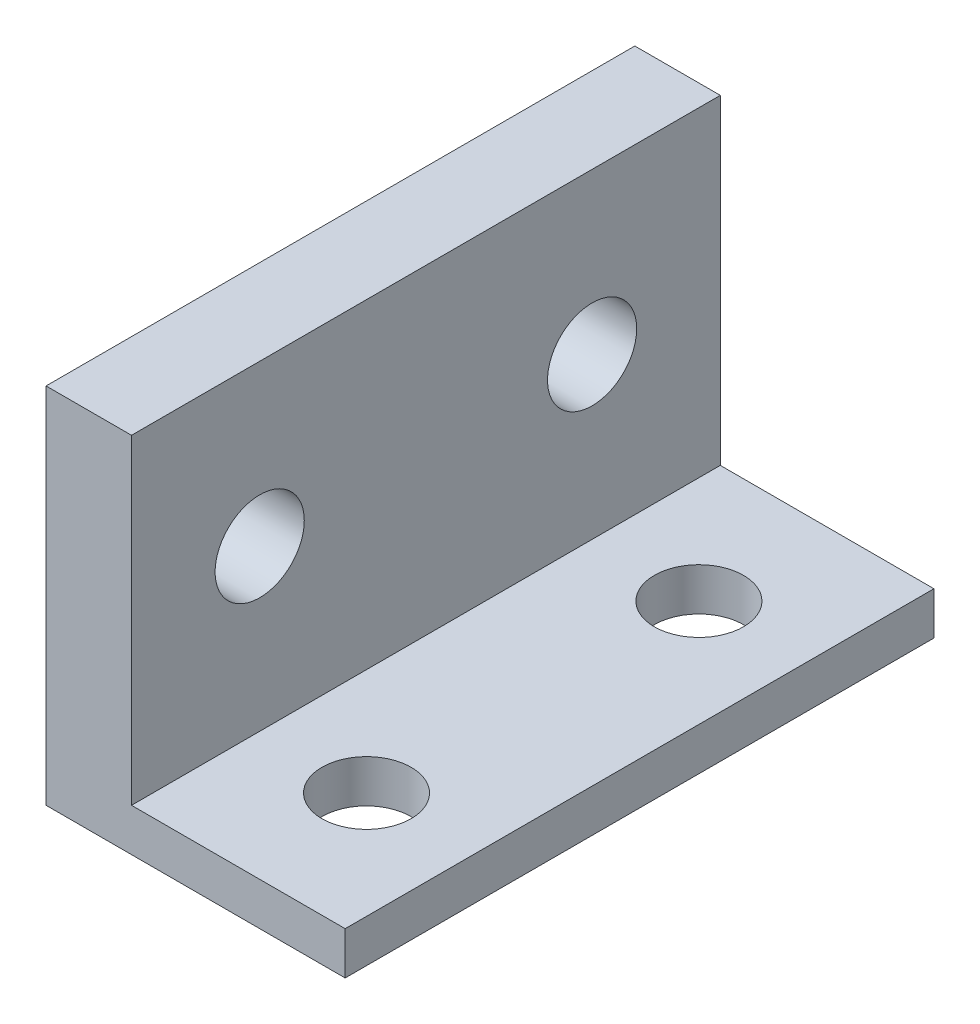
ISO-10303-21;
HEADER;
FILE_DESCRIPTION(('STEP AP214'),'2;1');
FILE_NAME('part.step','',(''),(''),'','','');
FILE_SCHEMA(('AUTOMOTIVE_DESIGN { 1 0 10303 214 1 1 1 1 }'));
ENDSEC;
DATA;
#1=APPLICATION_CONTEXT('core data for automotive mechanical design processes');
#2=APPLICATION_PROTOCOL_DEFINITION('international standard','automotive_design',2000,#1);
#3=PRODUCT_CONTEXT('',#1,'mechanical');
#4=PRODUCT('Part','Part','',(#3));
#5=PRODUCT_RELATED_PRODUCT_CATEGORY('part','',(#4));
#6=PRODUCT_DEFINITION_FORMATION('','',#4);
#7=PRODUCT_DEFINITION_CONTEXT('part definition',#1,'design');
#8=PRODUCT_DEFINITION('design','',#6,#7);
#9=PRODUCT_DEFINITION_SHAPE('','',#8);
#10=(LENGTH_UNIT() NAMED_UNIT(*) SI_UNIT(.MILLI.,.METRE.));
#11=(NAMED_UNIT(*) PLANE_ANGLE_UNIT() SI_UNIT($,.RADIAN.));
#12=(NAMED_UNIT(*) SI_UNIT($,.STERADIAN.) SOLID_ANGLE_UNIT());
#13=UNCERTAINTY_MEASURE_WITH_UNIT(LENGTH_MEASURE(1.E-05),#10,'distance_accuracy_value','');
#14=(GEOMETRIC_REPRESENTATION_CONTEXT(3) GLOBAL_UNCERTAINTY_ASSIGNED_CONTEXT((#13)) GLOBAL_UNIT_ASSIGNED_CONTEXT((#10,
#11,#12)) REPRESENTATION_CONTEXT('',''));
#15=CARTESIAN_POINT('',(0.,0.,0.));
#16=DIRECTION('',(0.,0.,1.));
#17=DIRECTION('',(1.,0.,0.));
#18=AXIS2_PLACEMENT_3D('',#15,#16,#17);
#19=CARTESIAN_POINT('',(0.,0.,35.));
#20=DIRECTION('',(0.,0.,1.));
#21=DIRECTION('',(1.,0.,0.));
#22=AXIS2_PLACEMENT_3D('',#19,#20,#21);
#23=PLANE('',#22);
#24=DIRECTION('',(1.,0.,0.));
#25=VECTOR('',#24,1.);
#26=CARTESIAN_POINT('',(0.,21.59,35.));
#27=LINE('',#26,#25);
#28=CARTESIAN_POINT('',(0.,21.59,35.));
#29=VERTEX_POINT('',#28);
#30=CARTESIAN_POINT('',(5.08,21.59,35.));
#31=VERTEX_POINT('',#30);
#32=EDGE_CURVE('E95',#29,#31,#27,.T.);
#33=ORIENTED_EDGE('',*,*,#32,.F.);
#34=DIRECTION('',(0.,1.,0.));
#35=VECTOR('',#34,1.);
#36=CARTESIAN_POINT('',(0.,2.54,35.));
#37=LINE('',#36,#35);
#38=CARTESIAN_POINT('',(0.,0.,35.));
#39=VERTEX_POINT('',#38);
#40=EDGE_CURVE('E140',#39,#29,#37,.T.);
#41=ORIENTED_EDGE('',*,*,#40,.F.);
#42=DIRECTION('',(1.,0.,0.));
#43=VECTOR('',#42,1.);
#44=CARTESIAN_POINT('',(0.,0.,35.));
#45=LINE('',#44,#43);
#46=CARTESIAN_POINT('',(17.78,0.,35.));
#47=VERTEX_POINT('',#46);
#48=EDGE_CURVE('E99',#39,#47,#45,.T.);
#49=ORIENTED_EDGE('',*,*,#48,.T.);
#50=DIRECTION('',(0.,1.,0.));
#51=VECTOR('',#50,1.);
#52=CARTESIAN_POINT('',(17.78,0.,35.));
#53=LINE('',#52,#51);
#54=CARTESIAN_POINT('',(17.78,2.54,35.));
#55=VERTEX_POINT('',#54);
#56=EDGE_CURVE('E109',#47,#55,#53,.T.);
#57=ORIENTED_EDGE('',*,*,#56,.T.);
#58=DIRECTION('',(1.,0.,0.));
#59=VECTOR('',#58,1.);
#60=CARTESIAN_POINT('',(0.,2.54,35.));
#61=LINE('',#60,#59);
#62=CARTESIAN_POINT('',(5.08,2.54,35.));
#63=VERTEX_POINT('',#62);
#64=EDGE_CURVE('E107',#63,#55,#61,.T.);
#65=ORIENTED_EDGE('',*,*,#64,.F.);
#66=DIRECTION('',(0.,1.,0.));
#67=VECTOR('',#66,1.);
#68=CARTESIAN_POINT('',(5.08,2.54,35.));
#69=LINE('',#68,#67);
#70=EDGE_CURVE('E137',#63,#31,#69,.T.);
#71=ORIENTED_EDGE('',*,*,#70,.T.);
#72=EDGE_LOOP('',(#33,#41,#49,#57,#65,#71));
#73=FACE_BOUND('',#72,.T.);
#74=ADVANCED_FACE('F33',(#73),#23,.T.);
#75=CARTESIAN_POINT('',(0.,21.59,35.));
#76=DIRECTION('',(0.,1.,0.));
#77=DIRECTION('',(0.,0.,1.));
#78=AXIS2_PLACEMENT_3D('',#75,#76,#77);
#79=PLANE('',#78);
#80=DIRECTION('',(1.,0.,0.));
#81=VECTOR('',#80,1.);
#82=CARTESIAN_POINT('',(0.,21.59,0.));
#83=LINE('',#82,#81);
#84=CARTESIAN_POINT('',(0.,21.59,0.));
#85=VERTEX_POINT('',#84);
#86=CARTESIAN_POINT('',(5.08,21.59,0.));
#87=VERTEX_POINT('',#86);
#88=EDGE_CURVE('E100',#85,#87,#83,.T.);
#89=ORIENTED_EDGE('',*,*,#88,.F.);
#90=DIRECTION('',(0.,0.,-1.));
#91=VECTOR('',#90,1.);
#92=CARTESIAN_POINT('',(0.,21.59,35.));
#93=LINE('',#92,#91);
#94=EDGE_CURVE('E11',#29,#85,#93,.T.);
#95=ORIENTED_EDGE('',*,*,#94,.F.);
#96=ORIENTED_EDGE('',*,*,#32,.T.);
#97=DIRECTION('',(0.,0.,-1.));
#98=VECTOR('',#97,1.);
#99=CARTESIAN_POINT('',(5.08,21.59,35.));
#100=LINE('',#99,#98);
#101=EDGE_CURVE('E142',#31,#87,#100,.T.);
#102=ORIENTED_EDGE('',*,*,#101,.T.);
#103=EDGE_LOOP('',(#89,#95,#96,#102));
#104=FACE_BOUND('',#103,.T.);
#105=ADVANCED_FACE('F148',(#104),#79,.T.);
#106=CARTESIAN_POINT('',(0.,0.,0.));
#107=DIRECTION('',(0.,0.,1.));
#108=DIRECTION('',(1.,0.,0.));
#109=AXIS2_PLACEMENT_3D('',#106,#107,#108);
#110=PLANE('',#109);
#111=ORIENTED_EDGE('',*,*,#88,.T.);
#112=DIRECTION('',(0.,1.,0.));
#113=VECTOR('',#112,1.);
#114=CARTESIAN_POINT('',(5.08,2.54,0.));
#115=LINE('',#114,#113);
#116=CARTESIAN_POINT('',(5.08,2.54,0.));
#117=VERTEX_POINT('',#116);
#118=EDGE_CURVE('E96',#117,#87,#115,.T.);
#119=ORIENTED_EDGE('',*,*,#118,.F.);
#120=DIRECTION('',(1.,0.,0.));
#121=VECTOR('',#120,1.);
#122=CARTESIAN_POINT('',(0.,2.54,0.));
#123=LINE('',#122,#121);
#124=CARTESIAN_POINT('',(17.78,2.54,0.));
#125=VERTEX_POINT('',#124);
#126=EDGE_CURVE('E111',#117,#125,#123,.T.);
#127=ORIENTED_EDGE('',*,*,#126,.T.);
#128=DIRECTION('',(0.,1.,0.));
#129=VECTOR('',#128,1.);
#130=CARTESIAN_POINT('',(17.78,0.,0.));
#131=LINE('',#130,#129);
#132=CARTESIAN_POINT('',(17.78,0.,0.));
#133=VERTEX_POINT('',#132);
#134=EDGE_CURVE('E106',#133,#125,#131,.T.);
#135=ORIENTED_EDGE('',*,*,#134,.F.);
#136=DIRECTION('',(1.,0.,0.));
#137=VECTOR('',#136,1.);
#138=CARTESIAN_POINT('',(0.,0.,0.));
#139=LINE('',#138,#137);
#140=CARTESIAN_POINT('',(0.,0.,0.));
#141=VERTEX_POINT('',#140);
#142=EDGE_CURVE('E82',#141,#133,#139,.T.);
#143=ORIENTED_EDGE('',*,*,#142,.F.);
#144=DIRECTION('',(0.,1.,0.));
#145=VECTOR('',#144,1.);
#146=CARTESIAN_POINT('',(0.,2.54,0.));
#147=LINE('',#146,#145);
#148=EDGE_CURVE('E88',#141,#85,#147,.T.);
#149=ORIENTED_EDGE('',*,*,#148,.T.);
#150=EDGE_LOOP('',(#111,#119,#127,#135,#143,#149));
#151=FACE_BOUND('',#150,.T.);
#152=ADVANCED_FACE('F104',(#151),#110,.F.);
#153=CARTESIAN_POINT('',(5.08,2.54,35.));
#154=DIRECTION('',(-1.,0.,0.));
#155=DIRECTION('',(0.,0.,1.));
#156=AXIS2_PLACEMENT_3D('',#153,#154,#155);
#157=PLANE('',#156);
#158=CARTESIAN_POINT('',(5.08,12.065,27.38));
#159=DIRECTION('',(1.,0.,0.));
#160=DIRECTION('',(0.,0.,-1.));
#161=AXIS2_PLACEMENT_3D('',#158,#159,#160);
#162=CIRCLE('',#161,2.65);
#163=CARTESIAN_POINT('',(5.08,12.065,24.73));
#164=VERTEX_POINT('',#163);
#165=EDGE_CURVE('E189',#164,#164,#162,.T.);
#166=ORIENTED_EDGE('',*,*,#165,.F.);
#167=EDGE_LOOP('',(#166));
#168=FACE_BOUND('',#167,.T.);
#169=CARTESIAN_POINT('',(5.08,12.065,7.62));
#170=DIRECTION('',(1.,0.,0.));
#171=DIRECTION('',(0.,0.,-1.));
#172=AXIS2_PLACEMENT_3D('',#169,#170,#171);
#173=CIRCLE('',#172,2.65);
#174=CARTESIAN_POINT('',(5.08,12.065,4.97));
#175=VERTEX_POINT('',#174);
#176=EDGE_CURVE('E127',#175,#175,#173,.T.);
#177=ORIENTED_EDGE('',*,*,#176,.F.);
#178=EDGE_LOOP('',(#177));
#179=FACE_BOUND('',#178,.T.);
#180=ORIENTED_EDGE('',*,*,#118,.T.);
#181=ORIENTED_EDGE('',*,*,#101,.F.);
#182=ORIENTED_EDGE('',*,*,#70,.F.);
#183=DIRECTION('',(0.,0.,-1.));
#184=VECTOR('',#183,1.);
#185=CARTESIAN_POINT('',(5.08,2.54,35.));
#186=LINE('',#185,#184);
#187=EDGE_CURVE('E43',#63,#117,#186,.T.);
#188=ORIENTED_EDGE('',*,*,#187,.T.);
#189=EDGE_LOOP('',(#180,#181,#182,#188));
#190=FACE_BOUND('',#189,.T.);
#191=ADVANCED_FACE('F151',(#168,#179,#190),#157,.F.);
#192=CARTESIAN_POINT('',(0.,2.54,35.));
#193=DIRECTION('',(-1.,0.,0.));
#194=DIRECTION('',(0.,0.,1.));
#195=AXIS2_PLACEMENT_3D('',#192,#193,#194);
#196=PLANE('',#195);
#197=CARTESIAN_POINT('',(0.,12.065,27.38));
#198=DIRECTION('',(1.,0.,0.));
#199=DIRECTION('',(0.,0.,-1.));
#200=AXIS2_PLACEMENT_3D('',#197,#198,#199);
#201=CIRCLE('',#200,2.65);
#202=CARTESIAN_POINT('',(0.,12.065,24.73));
#203=VERTEX_POINT('',#202);
#204=EDGE_CURVE('E132',#203,#203,#201,.T.);
#205=ORIENTED_EDGE('',*,*,#204,.T.);
#206=EDGE_LOOP('',(#205));
#207=FACE_BOUND('',#206,.T.);
#208=CARTESIAN_POINT('',(0.,12.065,7.62));
#209=DIRECTION('',(1.,0.,0.));
#210=DIRECTION('',(0.,0.,-1.));
#211=AXIS2_PLACEMENT_3D('',#208,#209,#210);
#212=CIRCLE('',#211,2.65);
#213=CARTESIAN_POINT('',(0.,12.065,4.97));
#214=VERTEX_POINT('',#213);
#215=EDGE_CURVE('E124',#214,#214,#212,.T.);
#216=ORIENTED_EDGE('',*,*,#215,.T.);
#217=EDGE_LOOP('',(#216));
#218=FACE_BOUND('',#217,.T.);
#219=ORIENTED_EDGE('',*,*,#148,.F.);
#220=DIRECTION('',(0.,0.,-1.));
#221=VECTOR('',#220,1.);
#222=CARTESIAN_POINT('',(0.,0.,35.));
#223=LINE('',#222,#221);
#224=EDGE_CURVE('E91',#39,#141,#223,.T.);
#225=ORIENTED_EDGE('',*,*,#224,.F.);
#226=ORIENTED_EDGE('',*,*,#40,.T.);
#227=ORIENTED_EDGE('',*,*,#94,.T.);
#228=EDGE_LOOP('',(#219,#225,#226,#227));
#229=FACE_BOUND('',#228,.T.);
#230=ADVANCED_FACE('F89',(#207,#218,#229),#196,.T.);
#231=CARTESIAN_POINT('',(0.,0.,35.));
#232=DIRECTION('',(0.,1.,0.));
#233=DIRECTION('',(0.,0.,1.));
#234=AXIS2_PLACEMENT_3D('',#231,#232,#233);
#235=PLANE('',#234);
#236=CARTESIAN_POINT('',(11.43,0.,27.38));
#237=DIRECTION('',(0.,1.,0.));
#238=DIRECTION('',(0.,0.,1.));
#239=AXIS2_PLACEMENT_3D('',#236,#237,#238);
#240=CIRCLE('',#239,2.65);
#241=CARTESIAN_POINT('',(11.43,0.,30.03));
#242=VERTEX_POINT('',#241);
#243=EDGE_CURVE('E202',#242,#242,#240,.T.);
#244=ORIENTED_EDGE('',*,*,#243,.T.);
#245=EDGE_LOOP('',(#244));
#246=FACE_BOUND('',#245,.T.);
#247=CARTESIAN_POINT('',(11.43,0.,7.62));
#248=DIRECTION('',(0.,1.,0.));
#249=DIRECTION('',(0.,0.,1.));
#250=AXIS2_PLACEMENT_3D('',#247,#248,#249);
#251=CIRCLE('',#250,2.65);
#252=CARTESIAN_POINT('',(11.43,0.,10.27));
#253=VERTEX_POINT('',#252);
#254=EDGE_CURVE('E193',#253,#253,#251,.T.);
#255=ORIENTED_EDGE('',*,*,#254,.T.);
#256=EDGE_LOOP('',(#255));
#257=FACE_BOUND('',#256,.T.);
#258=ORIENTED_EDGE('',*,*,#142,.T.);
#259=DIRECTION('',(0.,0.,-1.));
#260=VECTOR('',#259,1.);
#261=CARTESIAN_POINT('',(17.78,0.,35.));
#262=LINE('',#261,#260);
#263=EDGE_CURVE('E101',#47,#133,#262,.T.);
#264=ORIENTED_EDGE('',*,*,#263,.F.);
#265=ORIENTED_EDGE('',*,*,#48,.F.);
#266=ORIENTED_EDGE('',*,*,#224,.T.);
#267=EDGE_LOOP('',(#258,#264,#265,#266));
#268=FACE_BOUND('',#267,.T.);
#269=ADVANCED_FACE('F98',(#246,#257,#268),#235,.F.);
#270=CARTESIAN_POINT('',(17.78,0.,35.));
#271=DIRECTION('',(-1.,0.,0.));
#272=DIRECTION('',(0.,0.,1.));
#273=AXIS2_PLACEMENT_3D('',#270,#271,#272);
#274=PLANE('',#273);
#275=ORIENTED_EDGE('',*,*,#134,.T.);
#276=DIRECTION('',(0.,0.,-1.));
#277=VECTOR('',#276,1.);
#278=CARTESIAN_POINT('',(17.78,2.54,35.));
#279=LINE('',#278,#277);
#280=EDGE_CURVE('E37',#55,#125,#279,.T.);
#281=ORIENTED_EDGE('',*,*,#280,.F.);
#282=ORIENTED_EDGE('',*,*,#56,.F.);
#283=ORIENTED_EDGE('',*,*,#263,.T.);
#284=EDGE_LOOP('',(#275,#281,#282,#283));
#285=FACE_BOUND('',#284,.T.);
#286=ADVANCED_FACE('F155',(#285),#274,.F.);
#287=CARTESIAN_POINT('',(0.,2.54,35.));
#288=DIRECTION('',(0.,1.,0.));
#289=DIRECTION('',(0.,0.,1.));
#290=AXIS2_PLACEMENT_3D('',#287,#288,#289);
#291=PLANE('',#290);
#292=CARTESIAN_POINT('',(11.43,2.54,27.38));
#293=DIRECTION('',(0.,1.,0.));
#294=DIRECTION('',(0.,0.,1.));
#295=AXIS2_PLACEMENT_3D('',#292,#293,#294);
#296=CIRCLE('',#295,2.64999999999999);
#297=CARTESIAN_POINT('',(11.43,2.54,30.03));
#298=VERTEX_POINT('',#297);
#299=EDGE_CURVE('E205',#298,#298,#296,.T.);
#300=ORIENTED_EDGE('',*,*,#299,.F.);
#301=EDGE_LOOP('',(#300));
#302=FACE_BOUND('',#301,.T.);
#303=CARTESIAN_POINT('',(11.43,2.54,7.62));
#304=DIRECTION('',(0.,1.,0.));
#305=DIRECTION('',(0.,0.,1.));
#306=AXIS2_PLACEMENT_3D('',#303,#304,#305);
#307=CIRCLE('',#306,2.64999999999999);
#308=CARTESIAN_POINT('',(11.43,2.54,10.27));
#309=VERTEX_POINT('',#308);
#310=EDGE_CURVE('E197',#309,#309,#307,.T.);
#311=ORIENTED_EDGE('',*,*,#310,.F.);
#312=EDGE_LOOP('',(#311));
#313=FACE_BOUND('',#312,.T.);
#314=ORIENTED_EDGE('',*,*,#187,.F.);
#315=ORIENTED_EDGE('',*,*,#64,.T.);
#316=ORIENTED_EDGE('',*,*,#280,.T.);
#317=ORIENTED_EDGE('',*,*,#126,.F.);
#318=EDGE_LOOP('',(#314,#315,#316,#317));
#319=FACE_BOUND('',#318,.T.);
#320=ADVANCED_FACE('F35',(#302,#313,#319),#291,.T.);
#321=CARTESIAN_POINT('',(5.08,12.065,7.62));
#322=DIRECTION('',(1.,0.,0.));
#323=DIRECTION('',(0.,0.,-1.));
#324=AXIS2_PLACEMENT_3D('',#321,#322,#323);
#325=CYLINDRICAL_SURFACE('',#324,2.65);
#326=ORIENTED_EDGE('',*,*,#215,.F.);
#327=EDGE_LOOP('',(#326));
#328=FACE_BOUND('',#327,.T.);
#329=ORIENTED_EDGE('',*,*,#176,.T.);
#330=EDGE_LOOP('',(#329));
#331=FACE_BOUND('',#330,.T.);
#332=ADVANCED_FACE('F154',(#328,#331),#325,.F.);
#333=CARTESIAN_POINT('',(5.08,12.065,27.38));
#334=DIRECTION('',(1.,0.,0.));
#335=DIRECTION('',(0.,0.,-1.));
#336=AXIS2_PLACEMENT_3D('',#333,#334,#335);
#337=CYLINDRICAL_SURFACE('',#336,2.65);
#338=ORIENTED_EDGE('',*,*,#204,.F.);
#339=EDGE_LOOP('',(#338));
#340=FACE_BOUND('',#339,.T.);
#341=ORIENTED_EDGE('',*,*,#165,.T.);
#342=EDGE_LOOP('',(#341));
#343=FACE_BOUND('',#342,.T.);
#344=ADVANCED_FACE('F161',(#340,#343),#337,.F.);
#345=CARTESIAN_POINT('',(11.43,2.54,7.62));
#346=DIRECTION('',(0.,1.,0.));
#347=DIRECTION('',(0.,0.,1.));
#348=AXIS2_PLACEMENT_3D('',#345,#346,#347);
#349=CYLINDRICAL_SURFACE('',#348,2.64999999999999);
#350=ORIENTED_EDGE('',*,*,#254,.F.);
#351=EDGE_LOOP('',(#350));
#352=FACE_BOUND('',#351,.T.);
#353=ORIENTED_EDGE('',*,*,#310,.T.);
#354=EDGE_LOOP('',(#353));
#355=FACE_BOUND('',#354,.T.);
#356=ADVANCED_FACE('F210',(#352,#355),#349,.F.);
#357=CARTESIAN_POINT('',(11.43,2.54,27.38));
#358=DIRECTION('',(0.,1.,0.));
#359=DIRECTION('',(0.,0.,1.));
#360=AXIS2_PLACEMENT_3D('',#357,#358,#359);
#361=CYLINDRICAL_SURFACE('',#360,2.64999999999999);
#362=ORIENTED_EDGE('',*,*,#243,.F.);
#363=EDGE_LOOP('',(#362));
#364=FACE_BOUND('',#363,.T.);
#365=ORIENTED_EDGE('',*,*,#299,.T.);
#366=EDGE_LOOP('',(#365));
#367=FACE_BOUND('',#366,.T.);
#368=ADVANCED_FACE('F208',(#364,#367),#361,.F.);
#369=CLOSED_SHELL('',(#74,#105,#152,#191,#230,#269,#286,#320,#332,#344,#356,#368));
#370=MANIFOLD_SOLID_BREP('B2',#369);
#371=ADVANCED_BREP_SHAPE_REPRESENTATION('',(#18,#370),#14);
#372=SHAPE_DEFINITION_REPRESENTATION(#9,#371);
ENDSEC;
END-ISO-10303-21;
